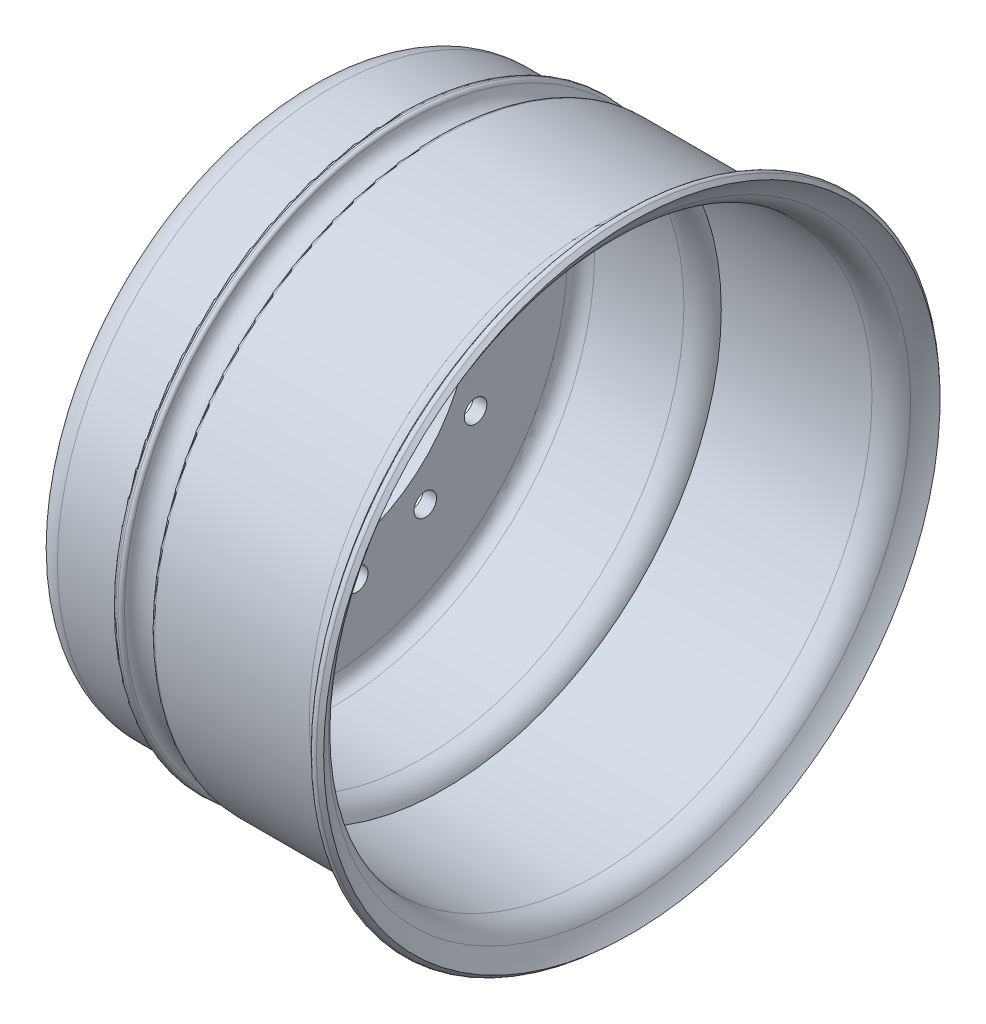
ISO-10303-21;
HEADER;
FILE_DESCRIPTION(('STEP AP214'),'2;1');
FILE_NAME('part.step','',(''),(''),'','','');
FILE_SCHEMA(('AUTOMOTIVE_DESIGN { 1 0 10303 214 1 1 1 1 }'));
ENDSEC;
DATA;
#1=APPLICATION_CONTEXT('core data for automotive mechanical design processes');
#2=APPLICATION_PROTOCOL_DEFINITION('international standard','automotive_design',2000,#1);
#3=PRODUCT_CONTEXT('',#1,'mechanical');
#4=PRODUCT('Part','Part','',(#3));
#5=PRODUCT_RELATED_PRODUCT_CATEGORY('part','',(#4));
#6=PRODUCT_DEFINITION_FORMATION('','',#4);
#7=PRODUCT_DEFINITION_CONTEXT('part definition',#1,'design');
#8=PRODUCT_DEFINITION('design','',#6,#7);
#9=PRODUCT_DEFINITION_SHAPE('','',#8);
#10=(LENGTH_UNIT() NAMED_UNIT(*) SI_UNIT(.MILLI.,.METRE.));
#11=(NAMED_UNIT(*) PLANE_ANGLE_UNIT() SI_UNIT($,.RADIAN.));
#12=(NAMED_UNIT(*) SI_UNIT($,.STERADIAN.) SOLID_ANGLE_UNIT());
#13=UNCERTAINTY_MEASURE_WITH_UNIT(LENGTH_MEASURE(1.E-05),#10,'distance_accuracy_value','');
#14=(GEOMETRIC_REPRESENTATION_CONTEXT(3) GLOBAL_UNCERTAINTY_ASSIGNED_CONTEXT((#13)) GLOBAL_UNIT_ASSIGNED_CONTEXT((#10,
#11,#12)) REPRESENTATION_CONTEXT('',''));
#15=CARTESIAN_POINT('',(0.,0.,0.));
#16=DIRECTION('',(0.,0.,1.));
#17=DIRECTION('',(1.,0.,0.));
#18=AXIS2_PLACEMENT_3D('',#15,#16,#17);
#19=CARTESIAN_POINT('',(0.,0.,0.));
#20=DIRECTION('',(-1.,0.,0.));
#21=DIRECTION('',(0.,0.,1.));
#22=AXIS2_PLACEMENT_3D('',#19,#20,#21);
#23=CYLINDRICAL_SURFACE('',#22,174.);
#24=CARTESIAN_POINT('',(-43.4076768123257,0.,0.));
#25=DIRECTION('',(-1.,0.,0.));
#26=DIRECTION('',(0.,0.,1.));
#27=AXIS2_PLACEMENT_3D('',#24,#25,#26);
#28=CIRCLE('',#27,174.);
#29=CARTESIAN_POINT('',(-43.4076768123257,0.,174.));
#30=VERTEX_POINT('',#29);
#31=EDGE_CURVE('E68',#30,#30,#28,.T.);
#32=ORIENTED_EDGE('',*,*,#31,.T.);
#33=EDGE_LOOP('',(#32));
#34=FACE_BOUND('',#33,.T.);
#35=CARTESIAN_POINT('',(16.,0.,0.));
#36=DIRECTION('',(-1.,0.,0.));
#37=DIRECTION('',(0.,0.,1.));
#38=AXIS2_PLACEMENT_3D('',#35,#36,#37);
#39=CIRCLE('',#38,174.);
#40=CARTESIAN_POINT('',(16.,0.,174.));
#41=VERTEX_POINT('',#40);
#42=EDGE_CURVE('E64',#41,#41,#39,.T.);
#43=ORIENTED_EDGE('',*,*,#42,.F.);
#44=EDGE_LOOP('',(#43));
#45=FACE_BOUND('',#44,.T.);
#46=ADVANCED_FACE('F32',(#34,#45),#23,.F.);
#47=CARTESIAN_POINT('',(16.,0.,0.));
#48=DIRECTION('',(-1.,0.,0.));
#49=DIRECTION('',(0.,0.,1.));
#50=AXIS2_PLACEMENT_3D('',#47,#48,#49);
#51=TOROIDAL_SURFACE('',#50,190.,16.);
#52=CARTESIAN_POINT('',(30.8323969741913,0.,0.));
#53=DIRECTION('',(-1.,0.,0.));
#54=DIRECTION('',(0.,0.,1.));
#55=AXIS2_PLACEMENT_3D('',#52,#53,#54);
#56=CIRCLE('',#55,184.);
#57=CARTESIAN_POINT('',(30.8323969741913,0.,184.));
#58=VERTEX_POINT('',#57);
#59=EDGE_CURVE('E72',#58,#58,#56,.T.);
#60=ORIENTED_EDGE('',*,*,#59,.F.);
#61=EDGE_LOOP('',(#60));
#62=FACE_BOUND('',#61,.T.);
#63=ORIENTED_EDGE('',*,*,#42,.T.);
#64=EDGE_LOOP('',(#63));
#65=FACE_BOUND('',#64,.T.);
#66=ADVANCED_FACE('F252',(#62,#65),#51,.T.);
#67=CARTESIAN_POINT('',(0.,0.,0.));
#68=DIRECTION('',(-1.,0.,0.));
#69=DIRECTION('',(0.,0.,1.));
#70=AXIS2_PLACEMENT_3D('',#67,#68,#69);
#71=CYLINDRICAL_SURFACE('',#70,184.);
#72=CARTESIAN_POINT('',(131.,0.,0.));
#73=DIRECTION('',(-1.,0.,0.));
#74=DIRECTION('',(0.,0.,1.));
#75=AXIS2_PLACEMENT_3D('',#72,#73,#74);
#76=CIRCLE('',#75,184.);
#77=CARTESIAN_POINT('',(131.,0.,184.));
#78=VERTEX_POINT('',#77);
#79=EDGE_CURVE('E75',#78,#78,#76,.T.);
#80=ORIENTED_EDGE('',*,*,#79,.F.);
#81=EDGE_LOOP('',(#80));
#82=FACE_BOUND('',#81,.T.);
#83=ORIENTED_EDGE('',*,*,#59,.T.);
#84=EDGE_LOOP('',(#83));
#85=FACE_BOUND('',#84,.T.);
#86=ADVANCED_FACE('F257',(#82,#85),#71,.F.);
#87=CARTESIAN_POINT('',(131.,0.,0.));
#88=DIRECTION('',(-1.,0.,0.));
#89=DIRECTION('',(0.,0.,1.));
#90=AXIS2_PLACEMENT_3D('',#87,#88,#89);
#91=TOROIDAL_SURFACE('',#90,202.5,18.5);
#92=CARTESIAN_POINT('',(147.150740079478,0.,0.));
#93=DIRECTION('',(-1.,0.,0.));
#94=DIRECTION('',(0.,0.,1.));
#95=AXIS2_PLACEMENT_3D('',#92,#93,#94);
#96=CIRCLE('',#95,193.477605922753);
#97=CARTESIAN_POINT('',(147.150740079478,0.,193.477605922753));
#98=VERTEX_POINT('',#97);
#99=EDGE_CURVE('E78',#98,#98,#96,.T.);
#100=ORIENTED_EDGE('',*,*,#99,.F.);
#101=EDGE_LOOP('',(#100));
#102=FACE_BOUND('',#101,.T.);
#103=ORIENTED_EDGE('',*,*,#79,.T.);
#104=EDGE_LOOP('',(#103));
#105=FACE_BOUND('',#104,.T.);
#106=ADVANCED_FACE('F263',(#102,#105),#91,.T.);
#107=CARTESIAN_POINT('',(198.658505738355,0.,0.));
#108=DIRECTION('',(-1.,0.,0.));
#109=DIRECTION('',(0.,0.,1.));
#110=AXIS2_PLACEMENT_3D('',#107,#108,#109);
#111=TOROIDAL_SURFACE('',#110,164.703484270994,59.);
#112=CARTESIAN_POINT('',(155.39924668354,0.,0.));
#113=DIRECTION('',(-1.,0.,0.));
#114=DIRECTION('',(0.,0.,1.));
#115=AXIS2_PLACEMENT_3D('',#112,#113,#114);
#116=CIRCLE('',#115,204.823759768907);
#117=CARTESIAN_POINT('',(155.39924668354,0.,204.823759768907));
#118=VERTEX_POINT('',#117);
#119=EDGE_CURVE('E81',#118,#118,#116,.T.);
#120=ORIENTED_EDGE('',*,*,#119,.F.);
#121=EDGE_LOOP('',(#120));
#122=FACE_BOUND('',#121,.T.);
#123=ORIENTED_EDGE('',*,*,#99,.T.);
#124=EDGE_LOOP('',(#123));
#125=FACE_BOUND('',#124,.T.);
#126=ADVANCED_FACE('F313',(#122,#125),#111,.F.);
#127=CARTESIAN_POINT('',(151.,0.,0.));
#128=DIRECTION('',(-1.,0.,0.));
#129=DIRECTION('',(0.,0.,1.));
#130=AXIS2_PLACEMENT_3D('',#127,#128,#129);
#131=CONICAL_SURFACE('',#130,208.903787785644,0.747769003171668);
#132=CARTESIAN_POINT('',(152.869694516403,0.,0.));
#133=DIRECTION('',(1.,0.,0.));
#134=DIRECTION('',(0.,0.,-1.));
#135=AXIS2_PLACEMENT_3D('',#132,#133,#134);
#136=CIRCLE('',#135,207.169762267547);
#137=CARTESIAN_POINT('',(152.869694516403,0.,-207.169762267547));
#138=VERTEX_POINT('',#137);
#139=EDGE_CURVE('E39',#138,#138,#136,.T.);
#140=ORIENTED_EDGE('',*,*,#139,.T.);
#141=EDGE_LOOP('',(#140));
#142=FACE_BOUND('',#141,.T.);
#143=ORIENTED_EDGE('',*,*,#119,.T.);
#144=EDGE_LOOP('',(#143));
#145=FACE_BOUND('',#144,.T.);
#146=ADVANCED_FACE('F290',(#142,#145),#131,.T.);
#147=CARTESIAN_POINT('',(198.658505738355,0.,0.));
#148=DIRECTION('',(-1.,0.,0.));
#149=DIRECTION('',(0.,0.,1.));
#150=AXIS2_PLACEMENT_3D('',#147,#148,#149);
#151=TOROIDAL_SURFACE('',#150,164.703484270994,65.);
#152=CARTESIAN_POINT('',(149.27012992694,0.,0.));
#153=DIRECTION('',(1.,0.,0.));
#154=DIRECTION('',(0.,0.,-1.));
#155=AXIS2_PLACEMENT_3D('',#152,#153,#154);
#156=CIRCLE('',#155,206.962073157874);
#157=CARTESIAN_POINT('',(149.27012992694,0.,-206.962073157874));
#158=VERTEX_POINT('',#157);
#159=EDGE_CURVE('E43',#158,#158,#156,.F.);
#160=ORIENTED_EDGE('',*,*,#159,.T.);
#161=EDGE_LOOP('',(#160));
#162=FACE_BOUND('',#161,.T.);
#163=CARTESIAN_POINT('',(141.912662215864,0.,0.));
#164=DIRECTION('',(-1.,0.,0.));
#165=DIRECTION('',(0.,0.,1.));
#166=AXIS2_PLACEMENT_3D('',#163,#164,#165);
#167=CIRCLE('',#166,196.403787785644);
#168=CARTESIAN_POINT('',(141.912662215864,0.,196.403787785644));
#169=VERTEX_POINT('',#168);
#170=EDGE_CURVE('E84',#169,#169,#167,.T.);
#171=ORIENTED_EDGE('',*,*,#170,.F.);
#172=EDGE_LOOP('',(#171));
#173=FACE_BOUND('',#172,.T.);
#174=ADVANCED_FACE('F286',(#162,#173),#151,.T.);
#175=CARTESIAN_POINT('',(131.,0.,0.));
#176=DIRECTION('',(-1.,0.,0.));
#177=DIRECTION('',(0.,0.,1.));
#178=AXIS2_PLACEMENT_3D('',#175,#176,#177);
#179=TOROIDAL_SURFACE('',#178,202.5,12.5);
#180=ORIENTED_EDGE('',*,*,#170,.T.);
#181=EDGE_LOOP('',(#180));
#182=FACE_BOUND('',#181,.T.);
#183=CARTESIAN_POINT('',(131.,0.,0.));
#184=DIRECTION('',(-1.,0.,0.));
#185=DIRECTION('',(0.,0.,1.));
#186=AXIS2_PLACEMENT_3D('',#183,#184,#185);
#187=CIRCLE('',#186,190.);
#188=CARTESIAN_POINT('',(131.,0.,190.));
#189=VERTEX_POINT('',#188);
#190=EDGE_CURVE('E87',#189,#189,#187,.T.);
#191=ORIENTED_EDGE('',*,*,#190,.F.);
#192=EDGE_LOOP('',(#191));
#193=FACE_BOUND('',#192,.T.);
#194=ADVANCED_FACE('F289',(#182,#193),#179,.F.);
#195=CARTESIAN_POINT('',(0.,0.,0.));
#196=DIRECTION('',(-1.,0.,0.));
#197=DIRECTION('',(0.,0.,1.));
#198=AXIS2_PLACEMENT_3D('',#195,#196,#197);
#199=CYLINDRICAL_SURFACE('',#198,190.);
#200=CARTESIAN_POINT('',(28.2474487139159,0.,0.));
#201=DIRECTION('',(1.,0.,0.));
#202=DIRECTION('',(0.,0.,-1.));
#203=AXIS2_PLACEMENT_3D('',#200,#201,#202);
#204=CIRCLE('',#203,190.);
#205=CARTESIAN_POINT('',(28.2474487139159,0.,-190.));
#206=VERTEX_POINT('',#205);
#207=EDGE_CURVE('E10',#206,#206,#204,.T.);
#208=ORIENTED_EDGE('',*,*,#207,.T.);
#209=EDGE_LOOP('',(#208));
#210=FACE_BOUND('',#209,.T.);
#211=ORIENTED_EDGE('',*,*,#190,.T.);
#212=EDGE_LOOP('',(#211));
#213=FACE_BOUND('',#212,.T.);
#214=ADVANCED_FACE('F296',(#210,#213),#199,.T.);
#215=CARTESIAN_POINT('',(16.,0.,0.));
#216=DIRECTION('',(-1.,0.,0.));
#217=DIRECTION('',(0.,0.,1.));
#218=AXIS2_PLACEMENT_3D('',#215,#216,#217);
#219=TOROIDAL_SURFACE('',#218,190.,10.);
#220=CARTESIAN_POINT('',(6.20204102886252,0.,0.));
#221=DIRECTION('',(1.,0.,0.));
#222=DIRECTION('',(0.,0.,-1.));
#223=AXIS2_PLACEMENT_3D('',#220,#221,#222);
#224=CIRCLE('',#223,187.999999999999);
#225=CARTESIAN_POINT('',(6.20204102886252,0.,-187.999999999999));
#226=VERTEX_POINT('',#225);
#227=EDGE_CURVE('E47',#226,#226,#224,.T.);
#228=ORIENTED_EDGE('',*,*,#227,.T.);
#229=EDGE_LOOP('',(#228));
#230=FACE_BOUND('',#229,.T.);
#231=CARTESIAN_POINT('',(25.7979589711458,0.,0.));
#232=DIRECTION('',(-1.,0.,0.));
#233=DIRECTION('',(0.,0.,1.));
#234=AXIS2_PLACEMENT_3D('',#231,#232,#233);
#235=CIRCLE('',#234,187.999999999997);
#236=CARTESIAN_POINT('',(25.7979589711458,0.,187.999999999997));
#237=VERTEX_POINT('',#236);
#238=EDGE_CURVE('E52',#237,#237,#235,.T.);
#239=ORIENTED_EDGE('',*,*,#238,.T.);
#240=EDGE_LOOP('',(#239));
#241=FACE_BOUND('',#240,.T.);
#242=ADVANCED_FACE('F301',(#230,#241),#219,.F.);
#243=CARTESIAN_POINT('',(0.,0.,0.));
#244=DIRECTION('',(-1.,0.,0.));
#245=DIRECTION('',(0.,0.,1.));
#246=AXIS2_PLACEMENT_3D('',#243,#244,#245);
#247=CYLINDRICAL_SURFACE('',#246,190.);
#248=CARTESIAN_POINT('',(2.5,0.,0.));
#249=DIRECTION('',(-1.,0.,0.));
#250=DIRECTION('',(0.,0.,1.));
#251=AXIS2_PLACEMENT_3D('',#248,#249,#250);
#252=CIRCLE('',#251,190.);
#253=CARTESIAN_POINT('',(2.5,0.,190.));
#254=VERTEX_POINT('',#253);
#255=EDGE_CURVE('E55',#254,#254,#252,.F.);
#256=ORIENTED_EDGE('',*,*,#255,.T.);
#257=EDGE_LOOP('',(#256));
#258=FACE_BOUND('',#257,.T.);
#259=CARTESIAN_POINT('',(3.7525512860841,0.,0.));
#260=DIRECTION('',(1.,0.,0.));
#261=DIRECTION('',(0.,0.,-1.));
#262=AXIS2_PLACEMENT_3D('',#259,#260,#261);
#263=CIRCLE('',#262,190.);
#264=CARTESIAN_POINT('',(3.7525512860841,0.,-190.));
#265=VERTEX_POINT('',#264);
#266=EDGE_CURVE('E58',#265,#265,#263,.F.);
#267=ORIENTED_EDGE('',*,*,#266,.T.);
#268=EDGE_LOOP('',(#267));
#269=FACE_BOUND('',#268,.T.);
#270=ADVANCED_FACE('F306',(#258,#269),#247,.T.);
#271=CARTESIAN_POINT('',(0.,32.5420841165349,-2.2724015883989E-13));
#272=DIRECTION('',(-1.,0.,0.));
#273=DIRECTION('',(0.,0.,1.));
#274=AXIS2_PLACEMENT_3D('',#271,#272,#273);
#275=PLANE('',#274);
#276=CARTESIAN_POINT('',(0.,0.,0.));
#277=DIRECTION('',(-1.,0.,0.));
#278=DIRECTION('',(0.,0.,1.));
#279=AXIS2_PLACEMENT_3D('',#276,#277,#278);
#280=CIRCLE('',#279,187.5);
#281=CARTESIAN_POINT('',(0.,0.,187.5));
#282=VERTEX_POINT('',#281);
#283=EDGE_CURVE('E61',#282,#282,#280,.T.);
#284=ORIENTED_EDGE('',*,*,#283,.T.);
#285=EDGE_LOOP('',(#284));
#286=FACE_BOUND('',#285,.T.);
#287=CARTESIAN_POINT('',(0.,0.,0.));
#288=DIRECTION('',(-1.,0.,0.));
#289=DIRECTION('',(0.,0.,1.));
#290=AXIS2_PLACEMENT_3D('',#287,#288,#289);
#291=CIRCLE('',#290,184.);
#292=CARTESIAN_POINT('',(0.,0.,184.));
#293=VERTEX_POINT('',#292);
#294=EDGE_CURVE('E90',#293,#293,#291,.T.);
#295=ORIENTED_EDGE('',*,*,#294,.F.);
#296=EDGE_LOOP('',(#295));
#297=FACE_BOUND('',#296,.T.);
#298=ADVANCED_FACE('F356',(#286,#297),#275,.T.);
#299=CARTESIAN_POINT('',(0.,0.,0.));
#300=DIRECTION('',(-1.,0.,0.));
#301=DIRECTION('',(0.,0.,1.));
#302=AXIS2_PLACEMENT_3D('',#299,#300,#301);
#303=CYLINDRICAL_SURFACE('',#302,184.);
#304=CARTESIAN_POINT('',(1.16760302580867,0.,0.));
#305=DIRECTION('',(-1.,0.,0.));
#306=DIRECTION('',(0.,0.,1.));
#307=AXIS2_PLACEMENT_3D('',#304,#305,#306);
#308=CIRCLE('',#307,184.);
#309=CARTESIAN_POINT('',(1.16760302580867,0.,184.));
#310=VERTEX_POINT('',#309);
#311=EDGE_CURVE('E93',#310,#310,#308,.T.);
#312=ORIENTED_EDGE('',*,*,#311,.F.);
#313=EDGE_LOOP('',(#312));
#314=FACE_BOUND('',#313,.T.);
#315=ORIENTED_EDGE('',*,*,#294,.T.);
#316=EDGE_LOOP('',(#315));
#317=FACE_BOUND('',#316,.T.);
#318=ADVANCED_FACE('F350',(#314,#317),#303,.F.);
#319=CARTESIAN_POINT('',(16.,0.,0.));
#320=DIRECTION('',(-1.,0.,0.));
#321=DIRECTION('',(0.,0.,1.));
#322=AXIS2_PLACEMENT_3D('',#319,#320,#321);
#323=TOROIDAL_SURFACE('',#322,190.,16.);
#324=CARTESIAN_POINT('',(1.61250543006184,0.,0.));
#325=DIRECTION('',(-1.,0.,0.));
#326=DIRECTION('',(0.,0.,1.));
#327=AXIS2_PLACEMENT_3D('',#324,#325,#326);
#328=CIRCLE('',#327,183.);
#329=CARTESIAN_POINT('',(1.61250543006184,0.,183.));
#330=VERTEX_POINT('',#329);
#331=EDGE_CURVE('E96',#330,#330,#328,.T.);
#332=ORIENTED_EDGE('',*,*,#331,.F.);
#333=EDGE_LOOP('',(#332));
#334=FACE_BOUND('',#333,.T.);
#335=ORIENTED_EDGE('',*,*,#311,.T.);
#336=EDGE_LOOP('',(#335));
#337=FACE_BOUND('',#336,.T.);
#338=ADVANCED_FACE('F355',(#334,#337),#323,.T.);
#339=CARTESIAN_POINT('',(0.,0.,0.));
#340=DIRECTION('',(-1.,0.,0.));
#341=DIRECTION('',(0.,0.,1.));
#342=AXIS2_PLACEMENT_3D('',#339,#340,#341);
#343=CYLINDRICAL_SURFACE('',#342,183.);
#344=ORIENTED_EDGE('',*,*,#331,.T.);
#345=EDGE_LOOP('',(#344));
#346=FACE_BOUND('',#345,.T.);
#347=CARTESIAN_POINT('',(-43.4076768123257,0.,0.));
#348=DIRECTION('',(-1.,0.,0.));
#349=DIRECTION('',(0.,0.,1.));
#350=AXIS2_PLACEMENT_3D('',#347,#348,#349);
#351=CIRCLE('',#350,183.);
#352=CARTESIAN_POINT('',(-43.4076768123257,0.,183.));
#353=VERTEX_POINT('',#352);
#354=EDGE_CURVE('E99',#353,#353,#351,.T.);
#355=ORIENTED_EDGE('',*,*,#354,.F.);
#356=EDGE_LOOP('',(#355));
#357=FACE_BOUND('',#356,.T.);
#358=ADVANCED_FACE('F368',(#346,#357),#343,.T.);
#359=CARTESIAN_POINT('',(-43.4076768123257,0.,0.));
#360=DIRECTION('',(-1.,0.,0.));
#361=DIRECTION('',(0.,0.,1.));
#362=AXIS2_PLACEMENT_3D('',#359,#360,#361);
#363=TOROIDAL_SURFACE('',#362,165.,18.);
#364=ORIENTED_EDGE('',*,*,#354,.T.);
#365=EDGE_LOOP('',(#364));
#366=FACE_BOUND('',#365,.T.);
#367=CARTESIAN_POINT('',(-61.4076768123257,0.,0.));
#368=DIRECTION('',(-1.,0.,0.));
#369=DIRECTION('',(0.,0.,1.));
#370=AXIS2_PLACEMENT_3D('',#367,#368,#369);
#371=CIRCLE('',#370,165.);
#372=CARTESIAN_POINT('',(-61.4076768123257,0.,165.));
#373=VERTEX_POINT('',#372);
#374=EDGE_CURVE('E102',#373,#373,#371,.T.);
#375=ORIENTED_EDGE('',*,*,#374,.F.);
#376=EDGE_LOOP('',(#375));
#377=FACE_BOUND('',#376,.T.);
#378=ADVANCED_FACE('F378',(#366,#377),#363,.T.);
#379=CARTESIAN_POINT('',(-61.4076768123257,32.5420841165349,-2.2724015883989E-13));
#380=DIRECTION('',(-1.,0.,0.));
#381=DIRECTION('',(0.,0.,1.));
#382=AXIS2_PLACEMENT_3D('',#379,#380,#381);
#383=PLANE('',#382);
#384=CARTESIAN_POINT('',(-61.4076768123257,109.625454917113,48.8083971690947));
#385=DIRECTION('',(-1.,0.,0.));
#386=DIRECTION('',(0.,-0.406736643075789,0.913545457642606));
#387=AXIS2_PLACEMENT_3D('',#384,#385,#386);
#388=CIRCLE('',#387,7.5);
#389=CARTESIAN_POINT('',(-61.4076768123257,106.574930094044,55.6599881014142));
#390=VERTEX_POINT('',#389);
#391=EDGE_CURVE('E196',#390,#390,#388,.T.);
#392=ORIENTED_EDGE('',*,*,#391,.F.);
#393=EDGE_LOOP('',(#392));
#394=FACE_BOUND('',#393,.T.);
#395=CARTESIAN_POINT('',(-61.4076768123257,80.2956727630641,89.1773790572863));
#396=DIRECTION('',(-1.,0.,0.));
#397=DIRECTION('',(0.,-0.743144825477386,0.669130606358867));
#398=AXIS2_PLACEMENT_3D('',#395,#396,#397);
#399=CIRCLE('',#398,7.5);
#400=CARTESIAN_POINT('',(-61.4076768123257,74.7220865719837,94.1958586049779));
#401=VERTEX_POINT('',#400);
#402=EDGE_CURVE('E190',#401,#401,#399,.T.);
#403=ORIENTED_EDGE('',*,*,#402,.F.);
#404=EDGE_LOOP('',(#403));
#405=FACE_BOUND('',#404,.T.);
#406=CARTESIAN_POINT('',(-61.4076768123257,37.0820393249949,114.126781955418));
#407=DIRECTION('',(-1.,0.,0.));
#408=DIRECTION('',(0.,-0.95105651629515,0.309016994374957));
#409=AXIS2_PLACEMENT_3D('',#406,#407,#408);
#410=CIRCLE('',#409,7.5);
#411=CARTESIAN_POINT('',(-61.4076768123257,29.9491154527813,116.44440941323));
#412=VERTEX_POINT('',#411);
#413=EDGE_CURVE('E184',#412,#412,#410,.T.);
#414=ORIENTED_EDGE('',*,*,#413,.F.);
#415=EDGE_LOOP('',(#414));
#416=FACE_BOUND('',#415,.T.);
#417=CARTESIAN_POINT('',(-61.4076768123257,-12.5434155921172,119.342627444193));
#418=DIRECTION('',(-1.,0.,0.));
#419=DIRECTION('',(0.,-0.994521895368274,-0.104528463267644));
#420=AXIS2_PLACEMENT_3D('',#417,#418,#419);
#421=CIRCLE('',#420,7.5);
#422=CARTESIAN_POINT('',(-61.4076768123257,-20.0023298073793,118.558663969686));
#423=VERTEX_POINT('',#422);
#424=EDGE_CURVE('E178',#423,#423,#421,.T.);
#425=ORIENTED_EDGE('',*,*,#424,.F.);
#426=EDGE_LOOP('',(#425));
#427=FACE_BOUND('',#426,.T.);
#428=CARTESIAN_POINT('',(-61.4076768123257,-59.999999999999,103.923048454133));
#429=DIRECTION('',(-1.,0.,0.));
#430=DIRECTION('',(0.,-0.866025403784443,-0.499999999999992));
#431=AXIS2_PLACEMENT_3D('',#428,#429,#430);
#432=CIRCLE('',#431,7.5);
#433=CARTESIAN_POINT('',(-61.4076768123257,-66.4951905283824,100.173048454133));
#434=VERTEX_POINT('',#433);
#435=EDGE_CURVE('E172',#434,#434,#432,.T.);
#436=ORIENTED_EDGE('',*,*,#435,.F.);
#437=EDGE_LOOP('',(#436));
#438=FACE_BOUND('',#437,.T.);
#439=CARTESIAN_POINT('',(-61.4076768123257,-97.0820393249931,70.5342302750976));
#440=DIRECTION('',(-1.,0.,0.));
#441=DIRECTION('',(0.,-0.58778525229248,-0.809016994374943));
#442=AXIS2_PLACEMENT_3D('',#439,#440,#441);
#443=CIRCLE('',#442,7.5);
#444=CARTESIAN_POINT('',(-61.4076768123257,-101.490428717187,64.4666028172855));
#445=VERTEX_POINT('',#444);
#446=EDGE_CURVE('E166',#445,#445,#443,.T.);
#447=ORIENTED_EDGE('',*,*,#446,.F.);
#448=EDGE_LOOP('',(#447));
#449=FACE_BOUND('',#448,.T.);
#450=CARTESIAN_POINT('',(-61.4076768123257,-117.377712088056,24.949402898132));
#451=DIRECTION('',(-1.,0.,0.));
#452=DIRECTION('',(0.,-0.207911690817766,-0.978147600733804));
#453=AXIS2_PLACEMENT_3D('',#450,#451,#452);
#454=CIRCLE('',#453,7.5);
#455=CARTESIAN_POINT('',(-61.4076768123257,-118.93704976919,17.6132958926284));
#456=VERTEX_POINT('',#455);
#457=EDGE_CURVE('E160',#456,#456,#454,.T.);
#458=ORIENTED_EDGE('',*,*,#457,.F.);
#459=EDGE_LOOP('',(#458));
#460=FACE_BOUND('',#459,.T.);
#461=CARTESIAN_POINT('',(-61.4076768123257,-117.377712088057,-24.9494028981304));
#462=DIRECTION('',(-1.,0.,0.));
#463=DIRECTION('',(0.,0.207911690817753,-0.978147600733807));
#464=AXIS2_PLACEMENT_3D('',#461,#462,#463);
#465=CIRCLE('',#464,7.5);
#466=CARTESIAN_POINT('',(-61.4076768123257,-115.818374406924,-32.2855099036339));
#467=VERTEX_POINT('',#466);
#468=EDGE_CURVE('E154',#467,#467,#465,.T.);
#469=ORIENTED_EDGE('',*,*,#468,.F.);
#470=EDGE_LOOP('',(#469));
#471=FACE_BOUND('',#470,.T.);
#472=CARTESIAN_POINT('',(-61.4076768123257,-97.0820393249941,-70.5342302750963));
#473=DIRECTION('',(-1.,0.,0.));
#474=DIRECTION('',(0.,0.587785252292469,-0.80901699437495));
#475=AXIS2_PLACEMENT_3D('',#472,#473,#474);
#476=CIRCLE('',#475,7.5);
#477=CARTESIAN_POINT('',(-61.4076768123257,-92.6736499328005,-76.6018577329084));
#478=VERTEX_POINT('',#477);
#479=EDGE_CURVE('E148',#478,#478,#476,.T.);
#480=ORIENTED_EDGE('',*,*,#479,.F.);
#481=EDGE_LOOP('',(#480));
#482=FACE_BOUND('',#481,.T.);
#483=CARTESIAN_POINT('',(-61.4076768123257,-60.0000000000005,-103.923048454132));
#484=DIRECTION('',(-1.,0.,0.));
#485=DIRECTION('',(0.,0.866025403784436,-0.500000000000004));
#486=AXIS2_PLACEMENT_3D('',#483,#484,#485);
#487=CIRCLE('',#486,7.5);
#488=CARTESIAN_POINT('',(-61.4076768123257,-53.5048094716172,-107.673048454132));
#489=VERTEX_POINT('',#488);
#490=EDGE_CURVE('E142',#489,#489,#487,.T.);
#491=ORIENTED_EDGE('',*,*,#490,.F.);
#492=EDGE_LOOP('',(#491));
#493=FACE_BOUND('',#492,.T.);
#494=CARTESIAN_POINT('',(-61.4076768123257,-12.5434155921189,-119.342627444193));
#495=DIRECTION('',(-1.,0.,0.));
#496=DIRECTION('',(0.,0.994521895368273,-0.104528463267657));
#497=AXIS2_PLACEMENT_3D('',#494,#495,#496);
#498=CIRCLE('',#497,7.5);
#499=CARTESIAN_POINT('',(-61.4076768123257,-5.0845013768568,-120.1265909187));
#500=VERTEX_POINT('',#499);
#501=EDGE_CURVE('E136',#500,#500,#498,.T.);
#502=ORIENTED_EDGE('',*,*,#501,.F.);
#503=EDGE_LOOP('',(#502));
#504=FACE_BOUND('',#503,.T.);
#505=CARTESIAN_POINT('',(-61.4076768123257,37.0820393249934,-114.126781955419));
#506=DIRECTION('',(-1.,0.,0.));
#507=DIRECTION('',(0.,0.951056516295154,0.309016994374945));
#508=AXIS2_PLACEMENT_3D('',#505,#506,#507);
#509=CIRCLE('',#508,7.5);
#510=CARTESIAN_POINT('',(-61.4076768123257,44.2149631972071,-111.809154497606));
#511=VERTEX_POINT('',#510);
#512=EDGE_CURVE('E130',#511,#511,#509,.T.);
#513=ORIENTED_EDGE('',*,*,#512,.F.);
#514=EDGE_LOOP('',(#513));
#515=FACE_BOUND('',#514,.T.);
#516=CARTESIAN_POINT('',(-61.4076768123257,80.2956727630628,-89.1773790572875));
#517=DIRECTION('',(-1.,0.,0.));
#518=DIRECTION('',(0.,0.743144825477395,0.669130606358857));
#519=AXIS2_PLACEMENT_3D('',#516,#517,#518);
#520=CIRCLE('',#519,7.5);
#521=CARTESIAN_POINT('',(-61.4076768123257,85.8692589541433,-84.158899509596));
#522=VERTEX_POINT('',#521);
#523=EDGE_CURVE('E124',#522,#522,#520,.T.);
#524=ORIENTED_EDGE('',*,*,#523,.F.);
#525=EDGE_LOOP('',(#524));
#526=FACE_BOUND('',#525,.T.);
#527=CARTESIAN_POINT('',(-61.4076768123257,109.625454917112,-48.8083971690961));
#528=DIRECTION('',(-1.,0.,0.));
#529=DIRECTION('',(0.,0.406736643075801,0.913545457642601));
#530=AXIS2_PLACEMENT_3D('',#527,#528,#529);
#531=CIRCLE('',#530,7.5);
#532=CARTESIAN_POINT('',(-61.4076768123257,112.675979740181,-41.9568062367766));
#533=VERTEX_POINT('',#532);
#534=EDGE_CURVE('E118',#533,#533,#531,.T.);
#535=ORIENTED_EDGE('',*,*,#534,.F.);
#536=EDGE_LOOP('',(#535));
#537=FACE_BOUND('',#536,.T.);
#538=CARTESIAN_POINT('',(-61.4076768123257,120.,0.));
#539=DIRECTION('',(-1.,0.,0.));
#540=DIRECTION('',(0.,0.,1.));
#541=AXIS2_PLACEMENT_3D('',#538,#539,#540);
#542=CIRCLE('',#541,7.5);
#543=CARTESIAN_POINT('',(-61.4076768123257,120.,7.5));
#544=VERTEX_POINT('',#543);
#545=EDGE_CURVE('E69',#544,#544,#542,.T.);
#546=ORIENTED_EDGE('',*,*,#545,.F.);
#547=EDGE_LOOP('',(#546));
#548=FACE_BOUND('',#547,.T.);
#549=ORIENTED_EDGE('',*,*,#374,.T.);
#550=EDGE_LOOP('',(#549));
#551=FACE_BOUND('',#550,.T.);
#552=CARTESIAN_POINT('',(-61.4076768123257,0.,0.));
#553=DIRECTION('',(-1.,0.,0.));
#554=DIRECTION('',(0.,0.,1.));
#555=AXIS2_PLACEMENT_3D('',#552,#553,#554);
#556=CIRCLE('',#555,100.);
#557=CARTESIAN_POINT('',(-61.4076768123257,0.,100.));
#558=VERTEX_POINT('',#557);
#559=EDGE_CURVE('E105',#558,#558,#556,.T.);
#560=ORIENTED_EDGE('',*,*,#559,.F.);
#561=EDGE_LOOP('',(#560));
#562=FACE_BOUND('',#561,.T.);
#563=ADVANCED_FACE('F388',(#394,#405,#416,#427,#438,#449,#460,#471,#482,#493,#504,#515,#526,
#537,#548,#551,#562),#383,.T.);
#564=CARTESIAN_POINT('',(0.,0.,0.));
#565=DIRECTION('',(-1.,0.,0.));
#566=DIRECTION('',(0.,0.,1.));
#567=AXIS2_PLACEMENT_3D('',#564,#565,#566);
#568=CYLINDRICAL_SURFACE('',#567,100.);
#569=ORIENTED_EDGE('',*,*,#559,.T.);
#570=EDGE_LOOP('',(#569));
#571=FACE_BOUND('',#570,.T.);
#572=CARTESIAN_POINT('',(-52.4076768123257,0.,0.));
#573=DIRECTION('',(-1.,0.,0.));
#574=DIRECTION('',(0.,0.,1.));
#575=AXIS2_PLACEMENT_3D('',#572,#573,#574);
#576=CIRCLE('',#575,100.);
#577=CARTESIAN_POINT('',(-52.4076768123257,0.,100.));
#578=VERTEX_POINT('',#577);
#579=EDGE_CURVE('E108',#578,#578,#576,.T.);
#580=ORIENTED_EDGE('',*,*,#579,.F.);
#581=EDGE_LOOP('',(#580));
#582=FACE_BOUND('',#581,.T.);
#583=ADVANCED_FACE('F210',(#571,#582),#568,.F.);
#584=CARTESIAN_POINT('',(-52.4076768123257,32.5420841165349,-2.2724015883989E-13));
#585=DIRECTION('',(1.,0.,0.));
#586=DIRECTION('',(0.,0.,-1.));
#587=AXIS2_PLACEMENT_3D('',#584,#585,#586);
#588=PLANE('',#587);
#589=CARTESIAN_POINT('',(-52.4076768123257,109.625454917113,48.8083971690947));
#590=DIRECTION('',(1.,0.,0.));
#591=DIRECTION('',(0.,0.406736643075789,-0.913545457642606));
#592=AXIS2_PLACEMENT_3D('',#589,#590,#591);
#593=CIRCLE('',#592,7.5);
#594=CARTESIAN_POINT('',(-52.4076768123257,112.675979740181,41.9568062367751));
#595=VERTEX_POINT('',#594);
#596=EDGE_CURVE('E199',#595,#595,#593,.T.);
#597=ORIENTED_EDGE('',*,*,#596,.F.);
#598=EDGE_LOOP('',(#597));
#599=FACE_BOUND('',#598,.T.);
#600=CARTESIAN_POINT('',(-52.4076768123257,80.2956727630641,89.1773790572863));
#601=DIRECTION('',(1.,0.,0.));
#602=DIRECTION('',(0.,0.743144825477386,-0.669130606358867));
#603=AXIS2_PLACEMENT_3D('',#600,#601,#602);
#604=CIRCLE('',#603,7.5);
#605=CARTESIAN_POINT('',(-52.4076768123257,85.8692589541444,84.1588995095948));
#606=VERTEX_POINT('',#605);
#607=EDGE_CURVE('E193',#606,#606,#604,.T.);
#608=ORIENTED_EDGE('',*,*,#607,.F.);
#609=EDGE_LOOP('',(#608));
#610=FACE_BOUND('',#609,.T.);
#611=CARTESIAN_POINT('',(-52.4076768123257,37.0820393249949,114.126781955418));
#612=DIRECTION('',(1.,0.,0.));
#613=DIRECTION('',(0.,0.95105651629515,-0.309016994374957));
#614=AXIS2_PLACEMENT_3D('',#611,#612,#613);
#615=CIRCLE('',#614,7.5);
#616=CARTESIAN_POINT('',(-52.4076768123257,44.2149631972085,111.809154497606));
#617=VERTEX_POINT('',#616);
#618=EDGE_CURVE('E187',#617,#617,#615,.T.);
#619=ORIENTED_EDGE('',*,*,#618,.F.);
#620=EDGE_LOOP('',(#619));
#621=FACE_BOUND('',#620,.T.);
#622=CARTESIAN_POINT('',(-52.4076768123257,-12.5434155921172,119.342627444193));
#623=DIRECTION('',(1.,0.,0.));
#624=DIRECTION('',(0.,0.994521895368274,0.104528463267644));
#625=AXIS2_PLACEMENT_3D('',#622,#623,#624);
#626=CIRCLE('',#625,7.5);
#627=CARTESIAN_POINT('',(-52.4076768123257,-5.08450137685518,120.1265909187));
#628=VERTEX_POINT('',#627);
#629=EDGE_CURVE('E181',#628,#628,#626,.T.);
#630=ORIENTED_EDGE('',*,*,#629,.F.);
#631=EDGE_LOOP('',(#630));
#632=FACE_BOUND('',#631,.T.);
#633=CARTESIAN_POINT('',(-52.4076768123257,-59.999999999999,103.923048454133));
#634=DIRECTION('',(1.,0.,0.));
#635=DIRECTION('',(0.,0.866025403784443,0.499999999999992));
#636=AXIS2_PLACEMENT_3D('',#633,#634,#635);
#637=CIRCLE('',#636,7.5);
#638=CARTESIAN_POINT('',(-52.4076768123257,-53.5048094716157,107.673048454133));
#639=VERTEX_POINT('',#638);
#640=EDGE_CURVE('E175',#639,#639,#637,.T.);
#641=ORIENTED_EDGE('',*,*,#640,.F.);
#642=EDGE_LOOP('',(#641));
#643=FACE_BOUND('',#642,.T.);
#644=CARTESIAN_POINT('',(-52.4076768123257,-97.0820393249931,70.5342302750976));
#645=DIRECTION('',(1.,0.,0.));
#646=DIRECTION('',(0.,0.58778525229248,0.809016994374943));
#647=AXIS2_PLACEMENT_3D('',#644,#645,#646);
#648=CIRCLE('',#647,7.5);
#649=CARTESIAN_POINT('',(-52.4076768123257,-92.6736499327995,76.6018577329097));
#650=VERTEX_POINT('',#649);
#651=EDGE_CURVE('E169',#650,#650,#648,.T.);
#652=ORIENTED_EDGE('',*,*,#651,.F.);
#653=EDGE_LOOP('',(#652));
#654=FACE_BOUND('',#653,.T.);
#655=CARTESIAN_POINT('',(-52.4076768123257,-117.377712088056,24.949402898132));
#656=DIRECTION('',(1.,0.,0.));
#657=DIRECTION('',(0.,0.207911690817766,0.978147600733804));
#658=AXIS2_PLACEMENT_3D('',#655,#656,#657);
#659=CIRCLE('',#658,7.5);
#660=CARTESIAN_POINT('',(-52.4076768123257,-115.818374406923,32.2855099036355));
#661=VERTEX_POINT('',#660);
#662=EDGE_CURVE('E163',#661,#661,#659,.T.);
#663=ORIENTED_EDGE('',*,*,#662,.F.);
#664=EDGE_LOOP('',(#663));
#665=FACE_BOUND('',#664,.T.);
#666=CARTESIAN_POINT('',(-52.4076768123257,-117.377712088057,-24.9494028981304));
#667=DIRECTION('',(1.,0.,0.));
#668=DIRECTION('',(0.,-0.207911690817753,0.978147600733807));
#669=AXIS2_PLACEMENT_3D('',#666,#667,#668);
#670=CIRCLE('',#669,7.5);
#671=CARTESIAN_POINT('',(-52.4076768123257,-118.93704976919,-17.6132958926268));
#672=VERTEX_POINT('',#671);
#673=EDGE_CURVE('E157',#672,#672,#670,.T.);
#674=ORIENTED_EDGE('',*,*,#673,.F.);
#675=EDGE_LOOP('',(#674));
#676=FACE_BOUND('',#675,.T.);
#677=CARTESIAN_POINT('',(-52.4076768123257,-97.0820393249941,-70.5342302750963));
#678=DIRECTION('',(1.,0.,0.));
#679=DIRECTION('',(0.,-0.587785252292469,0.80901699437495));
#680=AXIS2_PLACEMENT_3D('',#677,#678,#679);
#681=CIRCLE('',#680,7.5);
#682=CARTESIAN_POINT('',(-52.4076768123257,-101.490428717188,-64.4666028172841));
#683=VERTEX_POINT('',#682);
#684=EDGE_CURVE('E151',#683,#683,#681,.T.);
#685=ORIENTED_EDGE('',*,*,#684,.F.);
#686=EDGE_LOOP('',(#685));
#687=FACE_BOUND('',#686,.T.);
#688=CARTESIAN_POINT('',(-52.4076768123257,-60.0000000000005,-103.923048454132));
#689=DIRECTION('',(1.,0.,0.));
#690=DIRECTION('',(0.,-0.866025403784436,0.500000000000004));
#691=AXIS2_PLACEMENT_3D('',#688,#689,#690);
#692=CIRCLE('',#691,7.5);
#693=CARTESIAN_POINT('',(-52.4076768123257,-66.4951905283838,-100.173048454132));
#694=VERTEX_POINT('',#693);
#695=EDGE_CURVE('E145',#694,#694,#692,.T.);
#696=ORIENTED_EDGE('',*,*,#695,.F.);
#697=EDGE_LOOP('',(#696));
#698=FACE_BOUND('',#697,.T.);
#699=CARTESIAN_POINT('',(-52.4076768123257,-12.5434155921189,-119.342627444193));
#700=DIRECTION('',(1.,0.,0.));
#701=DIRECTION('',(0.,-0.994521895368273,0.104528463267657));
#702=AXIS2_PLACEMENT_3D('',#699,#700,#701);
#703=CIRCLE('',#702,7.5);
#704=CARTESIAN_POINT('',(-52.4076768123257,-20.0023298073809,-118.558663969685));
#705=VERTEX_POINT('',#704);
#706=EDGE_CURVE('E139',#705,#705,#703,.T.);
#707=ORIENTED_EDGE('',*,*,#706,.F.);
#708=EDGE_LOOP('',(#707));
#709=FACE_BOUND('',#708,.T.);
#710=CARTESIAN_POINT('',(-52.4076768123257,37.0820393249934,-114.126781955419));
#711=DIRECTION('',(1.,0.,0.));
#712=DIRECTION('',(0.,-0.951056516295154,-0.309016994374945));
#713=AXIS2_PLACEMENT_3D('',#710,#711,#712);
#714=CIRCLE('',#713,7.5);
#715=CARTESIAN_POINT('',(-52.4076768123257,29.9491154527797,-116.444409413231));
#716=VERTEX_POINT('',#715);
#717=EDGE_CURVE('E133',#716,#716,#714,.T.);
#718=ORIENTED_EDGE('',*,*,#717,.F.);
#719=EDGE_LOOP('',(#718));
#720=FACE_BOUND('',#719,.T.);
#721=CARTESIAN_POINT('',(-52.4076768123257,80.2956727630628,-89.1773790572875));
#722=DIRECTION('',(1.,0.,0.));
#723=DIRECTION('',(0.,-0.743144825477395,-0.669130606358857));
#724=AXIS2_PLACEMENT_3D('',#721,#722,#723);
#725=CIRCLE('',#724,7.5);
#726=CARTESIAN_POINT('',(-52.4076768123257,74.7220865719824,-94.1958586049789));
#727=VERTEX_POINT('',#726);
#728=EDGE_CURVE('E127',#727,#727,#725,.T.);
#729=ORIENTED_EDGE('',*,*,#728,.F.);
#730=EDGE_LOOP('',(#729));
#731=FACE_BOUND('',#730,.T.);
#732=CARTESIAN_POINT('',(-52.4076768123257,109.625454917112,-48.8083971690961));
#733=DIRECTION('',(1.,0.,0.));
#734=DIRECTION('',(0.,-0.406736643075801,-0.913545457642601));
#735=AXIS2_PLACEMENT_3D('',#732,#733,#734);
#736=CIRCLE('',#735,7.5);
#737=CARTESIAN_POINT('',(-52.4076768123257,106.574930094044,-55.6599881014156));
#738=VERTEX_POINT('',#737);
#739=EDGE_CURVE('E121',#738,#738,#736,.T.);
#740=ORIENTED_EDGE('',*,*,#739,.F.);
#741=EDGE_LOOP('',(#740));
#742=FACE_BOUND('',#741,.T.);
#743=CARTESIAN_POINT('',(-52.4076768123257,120.,0.));
#744=DIRECTION('',(1.,0.,0.));
#745=DIRECTION('',(0.,0.,-1.));
#746=AXIS2_PLACEMENT_3D('',#743,#744,#745);
#747=CIRCLE('',#746,7.5);
#748=CARTESIAN_POINT('',(-52.4076768123257,120.,-7.5));
#749=VERTEX_POINT('',#748);
#750=EDGE_CURVE('E65',#749,#749,#747,.T.);
#751=ORIENTED_EDGE('',*,*,#750,.F.);
#752=EDGE_LOOP('',(#751));
#753=FACE_BOUND('',#752,.T.);
#754=ORIENTED_EDGE('',*,*,#579,.T.);
#755=EDGE_LOOP('',(#754));
#756=FACE_BOUND('',#755,.T.);
#757=CARTESIAN_POINT('',(-52.4076768123257,0.,0.));
#758=DIRECTION('',(-1.,0.,0.));
#759=DIRECTION('',(0.,0.,1.));
#760=AXIS2_PLACEMENT_3D('',#757,#758,#759);
#761=CIRCLE('',#760,165.);
#762=CARTESIAN_POINT('',(-52.4076768123257,0.,165.));
#763=VERTEX_POINT('',#762);
#764=EDGE_CURVE('E111',#763,#763,#761,.T.);
#765=ORIENTED_EDGE('',*,*,#764,.F.);
#766=EDGE_LOOP('',(#765));
#767=FACE_BOUND('',#766,.T.);
#768=ADVANCED_FACE('F206',(#599,#610,#621,#632,#643,#654,#665,#676,#687,#698,#709,#720,#731,
#742,#753,#756,#767),#588,.T.);
#769=CARTESIAN_POINT('',(-43.4076768123257,0.,0.));
#770=DIRECTION('',(-1.,0.,0.));
#771=DIRECTION('',(0.,0.,1.));
#772=AXIS2_PLACEMENT_3D('',#769,#770,#771);
#773=TOROIDAL_SURFACE('',#772,165.,9.);
#774=ORIENTED_EDGE('',*,*,#764,.T.);
#775=EDGE_LOOP('',(#774));
#776=FACE_BOUND('',#775,.T.);
#777=ORIENTED_EDGE('',*,*,#31,.F.);
#778=EDGE_LOOP('',(#777));
#779=FACE_BOUND('',#778,.T.);
#780=ADVANCED_FACE('F209',(#776,#779),#773,.F.);
#781=CARTESIAN_POINT('',(155.39924668354,120.,0.));
#782=DIRECTION('',(-1.,0.,0.));
#783=DIRECTION('',(0.,0.,1.));
#784=AXIS2_PLACEMENT_3D('',#781,#782,#783);
#785=CYLINDRICAL_SURFACE('',#784,7.5);
#786=ORIENTED_EDGE('',*,*,#750,.T.);
#787=EDGE_LOOP('',(#786));
#788=FACE_BOUND('',#787,.T.);
#789=ORIENTED_EDGE('',*,*,#545,.T.);
#790=EDGE_LOOP('',(#789));
#791=FACE_BOUND('',#790,.T.);
#792=ADVANCED_FACE('F246',(#788,#791),#785,.F.);
#793=CARTESIAN_POINT('',(155.39924668354,109.625454917112,-48.8083971690961));
#794=DIRECTION('',(-1.,0.,0.));
#795=DIRECTION('',(0.,0.406736643075801,0.913545457642601));
#796=AXIS2_PLACEMENT_3D('',#793,#794,#795);
#797=CYLINDRICAL_SURFACE('',#796,7.5);
#798=ORIENTED_EDGE('',*,*,#739,.T.);
#799=EDGE_LOOP('',(#798));
#800=FACE_BOUND('',#799,.T.);
#801=ORIENTED_EDGE('',*,*,#534,.T.);
#802=EDGE_LOOP('',(#801));
#803=FACE_BOUND('',#802,.T.);
#804=ADVANCED_FACE('F416',(#800,#803),#797,.F.);
#805=CARTESIAN_POINT('',(155.39924668354,80.2956727630628,-89.1773790572875));
#806=DIRECTION('',(-1.,0.,0.));
#807=DIRECTION('',(0.,0.743144825477395,0.669130606358857));
#808=AXIS2_PLACEMENT_3D('',#805,#806,#807);
#809=CYLINDRICAL_SURFACE('',#808,7.5);
#810=ORIENTED_EDGE('',*,*,#728,.T.);
#811=EDGE_LOOP('',(#810));
#812=FACE_BOUND('',#811,.T.);
#813=ORIENTED_EDGE('',*,*,#523,.T.);
#814=EDGE_LOOP('',(#813));
#815=FACE_BOUND('',#814,.T.);
#816=ADVANCED_FACE('F438',(#812,#815),#809,.F.);
#817=CARTESIAN_POINT('',(155.39924668354,37.0820393249934,-114.126781955419));
#818=DIRECTION('',(-1.,0.,0.));
#819=DIRECTION('',(0.,0.951056516295154,0.309016994374945));
#820=AXIS2_PLACEMENT_3D('',#817,#818,#819);
#821=CYLINDRICAL_SURFACE('',#820,7.5);
#822=ORIENTED_EDGE('',*,*,#717,.T.);
#823=EDGE_LOOP('',(#822));
#824=FACE_BOUND('',#823,.T.);
#825=ORIENTED_EDGE('',*,*,#512,.T.);
#826=EDGE_LOOP('',(#825));
#827=FACE_BOUND('',#826,.T.);
#828=ADVANCED_FACE('F448',(#824,#827),#821,.F.);
#829=CARTESIAN_POINT('',(155.39924668354,-12.5434155921189,-119.342627444193));
#830=DIRECTION('',(-1.,0.,0.));
#831=DIRECTION('',(0.,0.994521895368273,-0.104528463267657));
#832=AXIS2_PLACEMENT_3D('',#829,#830,#831);
#833=CYLINDRICAL_SURFACE('',#832,7.5);
#834=ORIENTED_EDGE('',*,*,#706,.T.);
#835=EDGE_LOOP('',(#834));
#836=FACE_BOUND('',#835,.T.);
#837=ORIENTED_EDGE('',*,*,#501,.T.);
#838=EDGE_LOOP('',(#837));
#839=FACE_BOUND('',#838,.T.);
#840=ADVANCED_FACE('F458',(#836,#839),#833,.F.);
#841=CARTESIAN_POINT('',(155.39924668354,-60.0000000000005,-103.923048454132));
#842=DIRECTION('',(-1.,0.,0.));
#843=DIRECTION('',(0.,0.866025403784436,-0.500000000000004));
#844=AXIS2_PLACEMENT_3D('',#841,#842,#843);
#845=CYLINDRICAL_SURFACE('',#844,7.5);
#846=ORIENTED_EDGE('',*,*,#695,.T.);
#847=EDGE_LOOP('',(#846));
#848=FACE_BOUND('',#847,.T.);
#849=ORIENTED_EDGE('',*,*,#490,.T.);
#850=EDGE_LOOP('',(#849));
#851=FACE_BOUND('',#850,.T.);
#852=ADVANCED_FACE('F468',(#848,#851),#845,.F.);
#853=CARTESIAN_POINT('',(155.39924668354,-97.0820393249941,-70.5342302750963));
#854=DIRECTION('',(-1.,0.,0.));
#855=DIRECTION('',(0.,0.587785252292469,-0.80901699437495));
#856=AXIS2_PLACEMENT_3D('',#853,#854,#855);
#857=CYLINDRICAL_SURFACE('',#856,7.5);
#858=ORIENTED_EDGE('',*,*,#684,.T.);
#859=EDGE_LOOP('',(#858));
#860=FACE_BOUND('',#859,.T.);
#861=ORIENTED_EDGE('',*,*,#479,.T.);
#862=EDGE_LOOP('',(#861));
#863=FACE_BOUND('',#862,.T.);
#864=ADVANCED_FACE('F478',(#860,#863),#857,.F.);
#865=CARTESIAN_POINT('',(155.39924668354,-117.377712088057,-24.9494028981304));
#866=DIRECTION('',(-1.,0.,0.));
#867=DIRECTION('',(0.,0.207911690817753,-0.978147600733807));
#868=AXIS2_PLACEMENT_3D('',#865,#866,#867);
#869=CYLINDRICAL_SURFACE('',#868,7.5);
#870=ORIENTED_EDGE('',*,*,#673,.T.);
#871=EDGE_LOOP('',(#870));
#872=FACE_BOUND('',#871,.T.);
#873=ORIENTED_EDGE('',*,*,#468,.T.);
#874=EDGE_LOOP('',(#873));
#875=FACE_BOUND('',#874,.T.);
#876=ADVANCED_FACE('F488',(#872,#875),#869,.F.);
#877=CARTESIAN_POINT('',(155.39924668354,-117.377712088056,24.949402898132));
#878=DIRECTION('',(-1.,0.,0.));
#879=DIRECTION('',(0.,-0.207911690817766,-0.978147600733804));
#880=AXIS2_PLACEMENT_3D('',#877,#878,#879);
#881=CYLINDRICAL_SURFACE('',#880,7.5);
#882=ORIENTED_EDGE('',*,*,#662,.T.);
#883=EDGE_LOOP('',(#882));
#884=FACE_BOUND('',#883,.T.);
#885=ORIENTED_EDGE('',*,*,#457,.T.);
#886=EDGE_LOOP('',(#885));
#887=FACE_BOUND('',#886,.T.);
#888=ADVANCED_FACE('F498',(#884,#887),#881,.F.);
#889=CARTESIAN_POINT('',(155.39924668354,-97.0820393249931,70.5342302750976));
#890=DIRECTION('',(-1.,0.,0.));
#891=DIRECTION('',(0.,-0.58778525229248,-0.809016994374943));
#892=AXIS2_PLACEMENT_3D('',#889,#890,#891);
#893=CYLINDRICAL_SURFACE('',#892,7.5);
#894=ORIENTED_EDGE('',*,*,#651,.T.);
#895=EDGE_LOOP('',(#894));
#896=FACE_BOUND('',#895,.T.);
#897=ORIENTED_EDGE('',*,*,#446,.T.);
#898=EDGE_LOOP('',(#897));
#899=FACE_BOUND('',#898,.T.);
#900=ADVANCED_FACE('F508',(#896,#899),#893,.F.);
#901=CARTESIAN_POINT('',(155.39924668354,-59.999999999999,103.923048454133));
#902=DIRECTION('',(-1.,0.,0.));
#903=DIRECTION('',(0.,-0.866025403784443,-0.499999999999992));
#904=AXIS2_PLACEMENT_3D('',#901,#902,#903);
#905=CYLINDRICAL_SURFACE('',#904,7.5);
#906=ORIENTED_EDGE('',*,*,#640,.T.);
#907=EDGE_LOOP('',(#906));
#908=FACE_BOUND('',#907,.T.);
#909=ORIENTED_EDGE('',*,*,#435,.T.);
#910=EDGE_LOOP('',(#909));
#911=FACE_BOUND('',#910,.T.);
#912=ADVANCED_FACE('F518',(#908,#911),#905,.F.);
#913=CARTESIAN_POINT('',(155.39924668354,-12.5434155921172,119.342627444193));
#914=DIRECTION('',(-1.,0.,0.));
#915=DIRECTION('',(0.,-0.994521895368274,-0.104528463267644));
#916=AXIS2_PLACEMENT_3D('',#913,#914,#915);
#917=CYLINDRICAL_SURFACE('',#916,7.5);
#918=ORIENTED_EDGE('',*,*,#629,.T.);
#919=EDGE_LOOP('',(#918));
#920=FACE_BOUND('',#919,.T.);
#921=ORIENTED_EDGE('',*,*,#424,.T.);
#922=EDGE_LOOP('',(#921));
#923=FACE_BOUND('',#922,.T.);
#924=ADVANCED_FACE('F528',(#920,#923),#917,.F.);
#925=CARTESIAN_POINT('',(155.39924668354,37.0820393249949,114.126781955418));
#926=DIRECTION('',(-1.,0.,0.));
#927=DIRECTION('',(0.,-0.95105651629515,0.309016994374957));
#928=AXIS2_PLACEMENT_3D('',#925,#926,#927);
#929=CYLINDRICAL_SURFACE('',#928,7.5);
#930=ORIENTED_EDGE('',*,*,#618,.T.);
#931=EDGE_LOOP('',(#930));
#932=FACE_BOUND('',#931,.T.);
#933=ORIENTED_EDGE('',*,*,#413,.T.);
#934=EDGE_LOOP('',(#933));
#935=FACE_BOUND('',#934,.T.);
#936=ADVANCED_FACE('F538',(#932,#935),#929,.F.);
#937=CARTESIAN_POINT('',(155.39924668354,80.2956727630641,89.1773790572863));
#938=DIRECTION('',(-1.,0.,0.));
#939=DIRECTION('',(0.,-0.743144825477386,0.669130606358867));
#940=AXIS2_PLACEMENT_3D('',#937,#938,#939);
#941=CYLINDRICAL_SURFACE('',#940,7.5);
#942=ORIENTED_EDGE('',*,*,#607,.T.);
#943=EDGE_LOOP('',(#942));
#944=FACE_BOUND('',#943,.T.);
#945=ORIENTED_EDGE('',*,*,#402,.T.);
#946=EDGE_LOOP('',(#945));
#947=FACE_BOUND('',#946,.T.);
#948=ADVANCED_FACE('F548',(#944,#947),#941,.F.);
#949=CARTESIAN_POINT('',(155.39924668354,109.625454917113,48.8083971690947));
#950=DIRECTION('',(-1.,0.,0.));
#951=DIRECTION('',(0.,-0.406736643075789,0.913545457642606));
#952=AXIS2_PLACEMENT_3D('',#949,#950,#951);
#953=CYLINDRICAL_SURFACE('',#952,7.5);
#954=ORIENTED_EDGE('',*,*,#596,.T.);
#955=EDGE_LOOP('',(#954));
#956=FACE_BOUND('',#955,.T.);
#957=ORIENTED_EDGE('',*,*,#391,.T.);
#958=EDGE_LOOP('',(#957));
#959=FACE_BOUND('',#958,.T.);
#960=ADVANCED_FACE('F203',(#956,#959),#953,.F.);
#961=CARTESIAN_POINT('',(2.5,0.,0.));
#962=DIRECTION('',(-1.,0.,0.));
#963=DIRECTION('',(0.,0.,1.));
#964=AXIS2_PLACEMENT_3D('',#961,#962,#963);
#965=TOROIDAL_SURFACE('',#964,187.5,2.5);
#966=ORIENTED_EDGE('',*,*,#255,.F.);
#967=EDGE_LOOP('',(#966));
#968=FACE_BOUND('',#967,.T.);
#969=ORIENTED_EDGE('',*,*,#283,.F.);
#970=EDGE_LOOP('',(#969));
#971=FACE_BOUND('',#970,.T.);
#972=ADVANCED_FACE('F269',(#968,#971),#965,.T.);
#973=CARTESIAN_POINT('',(3.7525512860841,0.,0.));
#974=DIRECTION('',(1.,0.,0.));
#975=DIRECTION('',(0.,0.,-1.));
#976=AXIS2_PLACEMENT_3D('',#973,#974,#975);
#977=TOROIDAL_SURFACE('',#976,187.5,2.5);
#978=ORIENTED_EDGE('',*,*,#227,.F.);
#979=EDGE_LOOP('',(#978));
#980=FACE_BOUND('',#979,.T.);
#981=ORIENTED_EDGE('',*,*,#266,.F.);
#982=EDGE_LOOP('',(#981));
#983=FACE_BOUND('',#982,.T.);
#984=ADVANCED_FACE('F272',(#980,#983),#977,.T.);
#985=CARTESIAN_POINT('',(151.169682842763,0.,0.));
#986=DIRECTION('',(1.,0.,0.));
#987=DIRECTION('',(0.,0.,-1.));
#988=AXIS2_PLACEMENT_3D('',#985,#986,#987);
#989=TOROIDAL_SURFACE('',#988,205.336742816072,2.5);
#990=ORIENTED_EDGE('',*,*,#139,.F.);
#991=EDGE_LOOP('',(#990));
#992=FACE_BOUND('',#991,.T.);
#993=ORIENTED_EDGE('',*,*,#159,.F.);
#994=EDGE_LOOP('',(#993));
#995=FACE_BOUND('',#994,.T.);
#996=ADVANCED_FACE('F275',(#992,#995),#989,.T.);
#997=CARTESIAN_POINT('',(28.2474487139159,0.,0.));
#998=DIRECTION('',(1.,0.,0.));
#999=DIRECTION('',(0.,0.,-1.));
#1000=AXIS2_PLACEMENT_3D('',#997,#998,#999);
#1001=TOROIDAL_SURFACE('',#1000,187.5,2.5);
#1002=ORIENTED_EDGE('',*,*,#207,.F.);
#1003=EDGE_LOOP('',(#1002));
#1004=FACE_BOUND('',#1003,.T.);
#1005=ORIENTED_EDGE('',*,*,#238,.F.);
#1006=EDGE_LOOP('',(#1005));
#1007=FACE_BOUND('',#1006,.T.);
#1008=ADVANCED_FACE('F34',(#1004,#1007),#1001,.T.);
#1009=CLOSED_SHELL('',(#46,#66,#86,#106,#126,#146,#174,#194,#214,#242,#270,#298,#318,#338,#358,
#378,#563,#583,#768,#780,#792,#804,#816,#828,#840,#852,#864,#876,#888,#900,#912,#924,#936,#948,
#960,#972,#984,#996,#1008));
#1010=MANIFOLD_SOLID_BREP('B2',#1009);
#1011=ADVANCED_BREP_SHAPE_REPRESENTATION('',(#18,#1010),#14);
#1012=SHAPE_DEFINITION_REPRESENTATION(#9,#1011);
ENDSEC;
END-ISO-10303-21;
